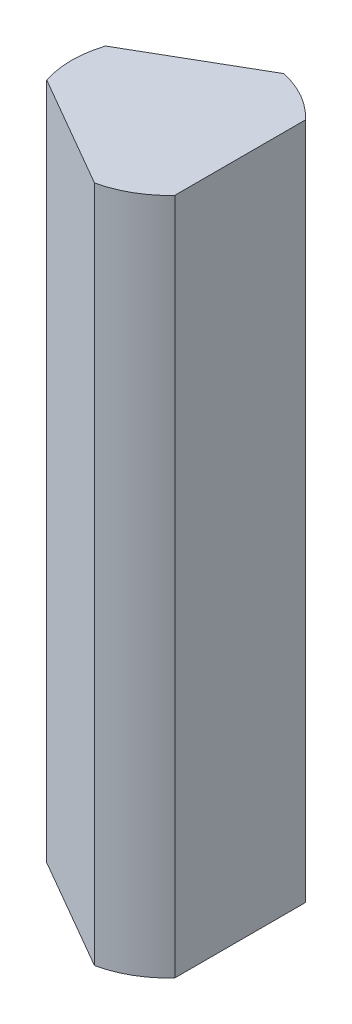
ISO-10303-21;
HEADER;
FILE_DESCRIPTION(('STEP AP214'),'2;1');
FILE_NAME('part.step','',(''),(''),'','','');
FILE_SCHEMA(('AUTOMOTIVE_DESIGN { 1 0 10303 214 1 1 1 1 }'));
ENDSEC;
DATA;
#1=APPLICATION_CONTEXT('core data for automotive mechanical design processes');
#2=APPLICATION_PROTOCOL_DEFINITION('international standard','automotive_design',2000,#1);
#3=PRODUCT_CONTEXT('',#1,'mechanical');
#4=PRODUCT('Part','Part','',(#3));
#5=PRODUCT_RELATED_PRODUCT_CATEGORY('part','',(#4));
#6=PRODUCT_DEFINITION_FORMATION('','',#4);
#7=PRODUCT_DEFINITION_CONTEXT('part definition',#1,'design');
#8=PRODUCT_DEFINITION('design','',#6,#7);
#9=PRODUCT_DEFINITION_SHAPE('','',#8);
#10=(LENGTH_UNIT() NAMED_UNIT(*) SI_UNIT(.MILLI.,.METRE.));
#11=(NAMED_UNIT(*) PLANE_ANGLE_UNIT() SI_UNIT($,.RADIAN.));
#12=(NAMED_UNIT(*) SI_UNIT($,.STERADIAN.) SOLID_ANGLE_UNIT());
#13=UNCERTAINTY_MEASURE_WITH_UNIT(LENGTH_MEASURE(1.E-05),#10,'distance_accuracy_value','');
#14=(GEOMETRIC_REPRESENTATION_CONTEXT(3) GLOBAL_UNCERTAINTY_ASSIGNED_CONTEXT((#13)) GLOBAL_UNIT_ASSIGNED_CONTEXT((#10,
#11,#12)) REPRESENTATION_CONTEXT('',''));
#15=CARTESIAN_POINT('',(0.,0.,0.));
#16=DIRECTION('',(0.,0.,1.));
#17=DIRECTION('',(1.,0.,0.));
#18=AXIS2_PLACEMENT_3D('',#15,#16,#17);
#19=CARTESIAN_POINT('',(0.,16.0875,0.));
#20=DIRECTION('',(0.,-1.,0.));
#21=DIRECTION('',(0.,0.,-1.));
#22=AXIS2_PLACEMENT_3D('',#19,#20,#21);
#23=CYLINDRICAL_SURFACE('',#22,2.3);
#24=CARTESIAN_POINT('',(0.,0.,0.));
#25=DIRECTION('',(0.,1.,0.));
#26=DIRECTION('',(0.,0.,1.));
#27=AXIS2_PLACEMENT_3D('',#24,#25,#26);
#28=CIRCLE('',#27,2.3);
#29=CARTESIAN_POINT('',(0.491640786499875,0.,2.24683985567503));
#30=VERTEX_POINT('',#29);
#31=CARTESIAN_POINT('',(1.7,0.,1.54919333848297));
#32=VERTEX_POINT('',#31);
#33=EDGE_CURVE('E121',#30,#32,#28,.T.);
#34=ORIENTED_EDGE('',*,*,#33,.T.);
#35=DIRECTION('',(0.,-1.,0.));
#36=VECTOR('',#35,1.);
#37=CARTESIAN_POINT('',(1.7,16.0875,1.54919333848297));
#38=LINE('',#37,#36);
#39=CARTESIAN_POINT('',(1.7,16.0875,1.54919333848297));
#40=VERTEX_POINT('',#39);
#41=EDGE_CURVE('E11',#40,#32,#38,.T.);
#42=ORIENTED_EDGE('',*,*,#41,.F.);
#43=CARTESIAN_POINT('',(0.,16.0875,0.));
#44=DIRECTION('',(0.,1.,0.));
#45=DIRECTION('',(0.,0.,1.));
#46=AXIS2_PLACEMENT_3D('',#43,#44,#45);
#47=CIRCLE('',#46,2.3);
#48=CARTESIAN_POINT('',(0.491640786499875,16.0875,2.24683985567503));
#49=VERTEX_POINT('',#48);
#50=EDGE_CURVE('E131',#49,#40,#47,.T.);
#51=ORIENTED_EDGE('',*,*,#50,.F.);
#52=DIRECTION('',(0.,-1.,0.));
#53=VECTOR('',#52,1.);
#54=CARTESIAN_POINT('',(0.491640786499875,16.0875,2.24683985567503));
#55=LINE('',#54,#53);
#56=EDGE_CURVE('E117',#49,#30,#55,.T.);
#57=ORIENTED_EDGE('',*,*,#56,.T.);
#58=EDGE_LOOP('',(#34,#42,#51,#57));
#59=FACE_BOUND('',#58,.T.);
#60=ADVANCED_FACE('F37',(#59),#23,.T.);
#61=CARTESIAN_POINT('',(1.7,16.0875,1.54919333848297));
#62=DIRECTION('',(-1.,0.,0.));
#63=DIRECTION('',(0.,0.,1.));
#64=AXIS2_PLACEMENT_3D('',#61,#62,#63);
#65=PLANE('',#64);
#66=DIRECTION('',(0.,0.,-1.));
#67=VECTOR('',#66,1.);
#68=CARTESIAN_POINT('',(1.7,0.,1.54919333848297));
#69=LINE('',#68,#67);
#70=CARTESIAN_POINT('',(1.7,0.,-1.54919333848297));
#71=VERTEX_POINT('',#70);
#72=EDGE_CURVE('E124',#32,#71,#69,.T.);
#73=ORIENTED_EDGE('',*,*,#72,.T.);
#74=DIRECTION('',(0.,-1.,0.));
#75=VECTOR('',#74,1.);
#76=CARTESIAN_POINT('',(1.7,16.0875,-1.54919333848297));
#77=LINE('',#76,#75);
#78=CARTESIAN_POINT('',(1.7,16.0875,-1.54919333848297));
#79=VERTEX_POINT('',#78);
#80=EDGE_CURVE('E45',#79,#71,#77,.T.);
#81=ORIENTED_EDGE('',*,*,#80,.F.);
#82=DIRECTION('',(0.,0.,-1.));
#83=VECTOR('',#82,1.);
#84=CARTESIAN_POINT('',(1.7,16.0875,1.54919333848297));
#85=LINE('',#84,#83);
#86=EDGE_CURVE('E90',#40,#79,#85,.T.);
#87=ORIENTED_EDGE('',*,*,#86,.F.);
#88=ORIENTED_EDGE('',*,*,#41,.T.);
#89=EDGE_LOOP('',(#73,#81,#87,#88));
#90=FACE_BOUND('',#89,.T.);
#91=ADVANCED_FACE('F155',(#90),#65,.F.);
#92=CARTESIAN_POINT('',(0.,16.0875,0.));
#93=DIRECTION('',(0.,-1.,0.));
#94=DIRECTION('',(0.,0.,-1.));
#95=AXIS2_PLACEMENT_3D('',#92,#93,#94);
#96=CYLINDRICAL_SURFACE('',#95,2.3);
#97=CARTESIAN_POINT('',(0.,0.,0.));
#98=DIRECTION('',(0.,1.,0.));
#99=DIRECTION('',(0.,0.,1.));
#100=AXIS2_PLACEMENT_3D('',#97,#98,#99);
#101=CIRCLE('',#100,2.3);
#102=CARTESIAN_POINT('',(0.491640786499875,0.,-2.24683985567503));
#103=VERTEX_POINT('',#102);
#104=EDGE_CURVE('E126',#71,#103,#101,.T.);
#105=ORIENTED_EDGE('',*,*,#104,.T.);
#106=DIRECTION('',(0.,-1.,0.));
#107=VECTOR('',#106,1.);
#108=CARTESIAN_POINT('',(0.491640786499875,16.0875,-2.24683985567503));
#109=LINE('',#108,#107);
#110=CARTESIAN_POINT('',(0.491640786499875,16.0875,-2.24683985567503));
#111=VERTEX_POINT('',#110);
#112=EDGE_CURVE('E112',#111,#103,#109,.T.);
#113=ORIENTED_EDGE('',*,*,#112,.F.);
#114=CARTESIAN_POINT('',(0.,16.0875,0.));
#115=DIRECTION('',(0.,1.,0.));
#116=DIRECTION('',(0.,0.,1.));
#117=AXIS2_PLACEMENT_3D('',#114,#115,#116);
#118=CIRCLE('',#117,2.3);
#119=EDGE_CURVE('E103',#79,#111,#118,.T.);
#120=ORIENTED_EDGE('',*,*,#119,.F.);
#121=ORIENTED_EDGE('',*,*,#80,.T.);
#122=EDGE_LOOP('',(#105,#113,#120,#121));
#123=FACE_BOUND('',#122,.T.);
#124=ADVANCED_FACE('F137',(#123),#96,.T.);
#125=CARTESIAN_POINT('',(-2.19164078649987,16.0875,-0.697646517192061));
#126=DIRECTION('',(0.5,0.,0.866025403784439));
#127=DIRECTION('',(0.866025403784439,0.,-0.5));
#128=AXIS2_PLACEMENT_3D('',#125,#126,#127);
#129=PLANE('',#128);
#130=DIRECTION('',(-0.866025403784439,0.,0.5));
#131=VECTOR('',#130,1.);
#132=CARTESIAN_POINT('',(-2.19164078649987,0.,-0.697646517192061));
#133=LINE('',#132,#131);
#134=CARTESIAN_POINT('',(-2.19164078649987,0.,-0.69764651719206));
#135=VERTEX_POINT('',#134);
#136=EDGE_CURVE('E111',#103,#135,#133,.T.);
#137=ORIENTED_EDGE('',*,*,#136,.T.);
#138=DIRECTION('',(0.,-1.,0.));
#139=VECTOR('',#138,1.);
#140=CARTESIAN_POINT('',(-2.19164078649987,16.0875,-0.69764651719206));
#141=LINE('',#140,#139);
#142=CARTESIAN_POINT('',(-2.19164078649987,16.0875,-0.69764651719206));
#143=VERTEX_POINT('',#142);
#144=EDGE_CURVE('E108',#143,#135,#141,.T.);
#145=ORIENTED_EDGE('',*,*,#144,.F.);
#146=DIRECTION('',(-0.866025403784439,0.,0.5));
#147=VECTOR('',#146,1.);
#148=CARTESIAN_POINT('',(-2.19164078649987,16.0875,-0.697646517192061));
#149=LINE('',#148,#147);
#150=EDGE_CURVE('E97',#111,#143,#149,.T.);
#151=ORIENTED_EDGE('',*,*,#150,.F.);
#152=ORIENTED_EDGE('',*,*,#112,.T.);
#153=EDGE_LOOP('',(#137,#145,#151,#152));
#154=FACE_BOUND('',#153,.T.);
#155=ADVANCED_FACE('F109',(#154),#129,.F.);
#156=CARTESIAN_POINT('',(0.,16.0875,0.));
#157=DIRECTION('',(0.,-1.,0.));
#158=DIRECTION('',(0.,0.,-1.));
#159=AXIS2_PLACEMENT_3D('',#156,#157,#158);
#160=CYLINDRICAL_SURFACE('',#159,2.3);
#161=CARTESIAN_POINT('',(0.,0.,0.));
#162=DIRECTION('',(0.,1.,0.));
#163=DIRECTION('',(0.,0.,-1.));
#164=AXIS2_PLACEMENT_3D('',#161,#162,#163);
#165=CIRCLE('',#164,2.3);
#166=CARTESIAN_POINT('',(-2.19164078649987,0.,0.697646517192063));
#167=VERTEX_POINT('',#166);
#168=EDGE_CURVE('E76',#135,#167,#165,.T.);
#169=ORIENTED_EDGE('',*,*,#168,.T.);
#170=DIRECTION('',(0.,-1.,0.));
#171=VECTOR('',#170,1.);
#172=CARTESIAN_POINT('',(-2.19164078649987,16.0875,0.697646517192063));
#173=LINE('',#172,#171);
#174=CARTESIAN_POINT('',(-2.19164078649987,16.0875,0.697646517192063));
#175=VERTEX_POINT('',#174);
#176=EDGE_CURVE('E113',#175,#167,#173,.T.);
#177=ORIENTED_EDGE('',*,*,#176,.F.);
#178=CARTESIAN_POINT('',(0.,16.0875,0.));
#179=DIRECTION('',(0.,1.,0.));
#180=DIRECTION('',(0.,0.,-1.));
#181=AXIS2_PLACEMENT_3D('',#178,#179,#180);
#182=CIRCLE('',#181,2.3);
#183=EDGE_CURVE('E101',#143,#175,#182,.T.);
#184=ORIENTED_EDGE('',*,*,#183,.F.);
#185=ORIENTED_EDGE('',*,*,#144,.T.);
#186=EDGE_LOOP('',(#169,#177,#184,#185));
#187=FACE_BOUND('',#186,.T.);
#188=ADVANCED_FACE('F115',(#187),#160,.T.);
#189=CARTESIAN_POINT('',(0.491640786499875,16.0875,2.24683985567503));
#190=DIRECTION('',(0.5,0.,-0.866025403784439));
#191=DIRECTION('',(-0.866025403784439,0.,-0.5));
#192=AXIS2_PLACEMENT_3D('',#189,#190,#191);
#193=PLANE('',#192);
#194=DIRECTION('',(0.866025403784439,0.,0.5));
#195=VECTOR('',#194,1.);
#196=CARTESIAN_POINT('',(0.491640786499875,0.,2.24683985567503));
#197=LINE('',#196,#195);
#198=EDGE_CURVE('E82',#167,#30,#197,.T.);
#199=ORIENTED_EDGE('',*,*,#198,.T.);
#200=ORIENTED_EDGE('',*,*,#56,.F.);
#201=DIRECTION('',(0.866025403784439,0.,0.5));
#202=VECTOR('',#201,1.);
#203=CARTESIAN_POINT('',(0.491640786499875,16.0875,2.24683985567503));
#204=LINE('',#203,#202);
#205=EDGE_CURVE('E53',#175,#49,#204,.T.);
#206=ORIENTED_EDGE('',*,*,#205,.F.);
#207=ORIENTED_EDGE('',*,*,#176,.T.);
#208=EDGE_LOOP('',(#199,#200,#206,#207));
#209=FACE_BOUND('',#208,.T.);
#210=ADVANCED_FACE('F144',(#209),#193,.F.);
#211=CARTESIAN_POINT('',(0.,16.0875,0.));
#212=DIRECTION('',(0.,1.,0.));
#213=DIRECTION('',(0.,0.,1.));
#214=AXIS2_PLACEMENT_3D('',#211,#212,#213);
#215=PLANE('',#214);
#216=ORIENTED_EDGE('',*,*,#50,.T.);
#217=ORIENTED_EDGE('',*,*,#86,.T.);
#218=ORIENTED_EDGE('',*,*,#119,.T.);
#219=ORIENTED_EDGE('',*,*,#150,.T.);
#220=ORIENTED_EDGE('',*,*,#183,.T.);
#221=ORIENTED_EDGE('',*,*,#205,.T.);
#222=EDGE_LOOP('',(#216,#217,#218,#219,#220,#221));
#223=FACE_BOUND('',#222,.T.);
#224=ADVANCED_FACE('F99',(#223),#215,.T.);
#225=CARTESIAN_POINT('',(0.,0.,0.));
#226=DIRECTION('',(0.,1.,0.));
#227=DIRECTION('',(0.,0.,1.));
#228=AXIS2_PLACEMENT_3D('',#225,#226,#227);
#229=PLANE('',#228);
#230=ORIENTED_EDGE('',*,*,#33,.F.);
#231=ORIENTED_EDGE('',*,*,#198,.F.);
#232=ORIENTED_EDGE('',*,*,#168,.F.);
#233=ORIENTED_EDGE('',*,*,#136,.F.);
#234=ORIENTED_EDGE('',*,*,#104,.F.);
#235=ORIENTED_EDGE('',*,*,#72,.F.);
#236=EDGE_LOOP('',(#230,#231,#232,#233,#234,#235));
#237=FACE_BOUND('',#236,.T.);
#238=ADVANCED_FACE('F140',(#237),#229,.F.);
#239=CLOSED_SHELL('',(#60,#91,#124,#155,#188,#210,#224,#238));
#240=MANIFOLD_SOLID_BREP('B2',#239);
#241=ADVANCED_BREP_SHAPE_REPRESENTATION('',(#18,#240),#14);
#242=SHAPE_DEFINITION_REPRESENTATION(#9,#241);
ENDSEC;
END-ISO-10303-21;
